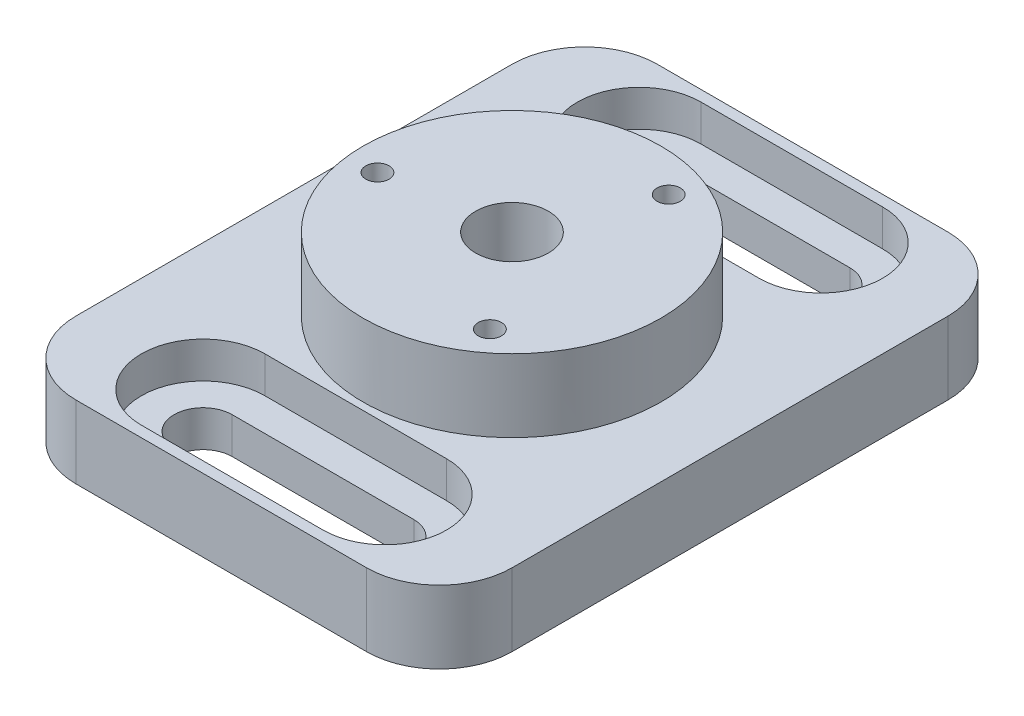
ISO-10303-21;
HEADER;
FILE_DESCRIPTION(('STEP AP214'),'2;1');
FILE_NAME('part.step','',(''),(''),'','','');
FILE_SCHEMA(('AUTOMOTIVE_DESIGN { 1 0 10303 214 1 1 1 1 }'));
ENDSEC;
DATA;
#1=APPLICATION_CONTEXT('core data for automotive mechanical design processes');
#2=APPLICATION_PROTOCOL_DEFINITION('international standard','automotive_design',2000,#1);
#3=PRODUCT_CONTEXT('',#1,'mechanical');
#4=PRODUCT('Part','Part','',(#3));
#5=PRODUCT_RELATED_PRODUCT_CATEGORY('part','',(#4));
#6=PRODUCT_DEFINITION_FORMATION('','',#4);
#7=PRODUCT_DEFINITION_CONTEXT('part definition',#1,'design');
#8=PRODUCT_DEFINITION('design','',#6,#7);
#9=PRODUCT_DEFINITION_SHAPE('','',#8);
#10=(LENGTH_UNIT() NAMED_UNIT(*) SI_UNIT(.MILLI.,.METRE.));
#11=(NAMED_UNIT(*) PLANE_ANGLE_UNIT() SI_UNIT($,.RADIAN.));
#12=(NAMED_UNIT(*) SI_UNIT($,.STERADIAN.) SOLID_ANGLE_UNIT());
#13=UNCERTAINTY_MEASURE_WITH_UNIT(LENGTH_MEASURE(1.E-05),#10,'distance_accuracy_value','');
#14=(GEOMETRIC_REPRESENTATION_CONTEXT(3) GLOBAL_UNCERTAINTY_ASSIGNED_CONTEXT((#13)) GLOBAL_UNIT_ASSIGNED_CONTEXT((#10,
#11,#12)) REPRESENTATION_CONTEXT('',''));
#15=CARTESIAN_POINT('',(0.,0.,0.));
#16=DIRECTION('',(0.,0.,1.));
#17=DIRECTION('',(1.,0.,0.));
#18=AXIS2_PLACEMENT_3D('',#15,#16,#17);
#19=CARTESIAN_POINT('',(6.31427663402399,20.,-15.2440122864362));
#20=DIRECTION('',(0.,-1.,0.));
#21=DIRECTION('',(0.,0.,-1.));
#22=AXIS2_PLACEMENT_3D('',#19,#20,#21);
#23=CYLINDRICAL_SURFACE('',#22,1.6);
#24=CARTESIAN_POINT('',(6.31427663402399,20.,-15.2440122864362));
#25=DIRECTION('',(0.,1.,0.));
#26=DIRECTION('',(0.,0.,1.));
#27=AXIS2_PLACEMENT_3D('',#24,#25,#26);
#28=CIRCLE('',#27,1.6);
#29=CARTESIAN_POINT('',(6.31427663402399,20.,-13.6440122864362));
#30=VERTEX_POINT('',#29);
#31=EDGE_CURVE('E459',#30,#30,#28,.T.);
#32=ORIENTED_EDGE('',*,*,#31,.T.);
#33=EDGE_LOOP('',(#32));
#34=FACE_BOUND('',#33,.T.);
#35=CARTESIAN_POINT('',(6.31427663402399,7.,-15.2440122864362));
#36=DIRECTION('',(0.,-1.,0.));
#37=DIRECTION('',(0.,0.,-1.));
#38=AXIS2_PLACEMENT_3D('',#35,#36,#37);
#39=CIRCLE('',#38,1.6);
#40=CARTESIAN_POINT('',(6.31427663402399,7.,-16.8440122864362));
#41=VERTEX_POINT('',#40);
#42=EDGE_CURVE('E49',#41,#41,#39,.T.);
#43=ORIENTED_EDGE('',*,*,#42,.T.);
#44=EDGE_LOOP('',(#43));
#45=FACE_BOUND('',#44,.T.);
#46=ADVANCED_FACE('F45',(#34,#45),#23,.F.);
#47=CARTESIAN_POINT('',(10.0445635786439,20.,13.0903301148054));
#48=DIRECTION('',(0.,-1.,0.));
#49=DIRECTION('',(0.,0.,-1.));
#50=AXIS2_PLACEMENT_3D('',#47,#48,#49);
#51=CYLINDRICAL_SURFACE('',#50,1.6);
#52=CARTESIAN_POINT('',(10.0445635786439,20.,13.0903301148054));
#53=DIRECTION('',(0.,1.,0.));
#54=DIRECTION('',(0.,0.,1.));
#55=AXIS2_PLACEMENT_3D('',#52,#53,#54);
#56=CIRCLE('',#55,1.6);
#57=CARTESIAN_POINT('',(10.0445635786439,20.,14.6903301148054));
#58=VERTEX_POINT('',#57);
#59=EDGE_CURVE('E455',#58,#58,#56,.T.);
#60=ORIENTED_EDGE('',*,*,#59,.T.);
#61=EDGE_LOOP('',(#60));
#62=FACE_BOUND('',#61,.T.);
#63=CARTESIAN_POINT('',(10.0445635786439,7.,13.0903301148054));
#64=DIRECTION('',(0.,-1.,0.));
#65=DIRECTION('',(0.,0.,-1.));
#66=AXIS2_PLACEMENT_3D('',#63,#64,#65);
#67=CIRCLE('',#66,1.6);
#68=CARTESIAN_POINT('',(10.0445635786439,7.,11.4903301148054));
#69=VERTEX_POINT('',#68);
#70=EDGE_CURVE('E517',#69,#69,#67,.T.);
#71=ORIENTED_EDGE('',*,*,#70,.T.);
#72=EDGE_LOOP('',(#71));
#73=FACE_BOUND('',#72,.T.);
#74=ADVANCED_FACE('F624',(#62,#73),#51,.F.);
#75=CARTESIAN_POINT('',(-16.3588402126679,20.,2.15368217163084));
#76=DIRECTION('',(0.,-1.,0.));
#77=DIRECTION('',(0.,0.,-1.));
#78=AXIS2_PLACEMENT_3D('',#75,#76,#77);
#79=CYLINDRICAL_SURFACE('',#78,1.6);
#80=CARTESIAN_POINT('',(-16.3588402126679,20.,2.15368217163084));
#81=DIRECTION('',(0.,1.,0.));
#82=DIRECTION('',(0.,0.,1.));
#83=AXIS2_PLACEMENT_3D('',#80,#81,#82);
#84=CIRCLE('',#83,1.6);
#85=CARTESIAN_POINT('',(-16.3588402126679,20.,3.75368217163085));
#86=VERTEX_POINT('',#85);
#87=EDGE_CURVE('E449',#86,#86,#84,.T.);
#88=ORIENTED_EDGE('',*,*,#87,.T.);
#89=EDGE_LOOP('',(#88));
#90=FACE_BOUND('',#89,.T.);
#91=CARTESIAN_POINT('',(-16.3588402126679,7.,2.15368217163084));
#92=DIRECTION('',(0.,-1.,0.));
#93=DIRECTION('',(0.,0.,-1.));
#94=AXIS2_PLACEMENT_3D('',#91,#92,#93);
#95=CIRCLE('',#94,1.6);
#96=CARTESIAN_POINT('',(-16.3588402126679,7.,0.553682171630843));
#97=VERTEX_POINT('',#96);
#98=EDGE_CURVE('E514',#97,#97,#95,.T.);
#99=ORIENTED_EDGE('',*,*,#98,.T.);
#100=EDGE_LOOP('',(#99));
#101=FACE_BOUND('',#100,.T.);
#102=ADVANCED_FACE('F630',(#90,#101),#79,.F.);
#103=CARTESIAN_POINT('',(-12.5,10.,-30.));
#104=DIRECTION('',(0.,-1.,0.));
#105=DIRECTION('',(0.,0.,-1.));
#106=AXIS2_PLACEMENT_3D('',#103,#104,#105);
#107=CYLINDRICAL_SURFACE('',#106,4.);
#108=CARTESIAN_POINT('',(-12.5,5.,-30.));
#109=DIRECTION('',(0.,1.,0.));
#110=DIRECTION('',(0.,0.,1.));
#111=AXIS2_PLACEMENT_3D('',#108,#109,#110);
#112=CIRCLE('',#111,4.);
#113=CARTESIAN_POINT('',(-12.5,5.,-26.));
#114=VERTEX_POINT('',#113);
#115=CARTESIAN_POINT('',(-12.5,5.,-34.));
#116=VERTEX_POINT('',#115);
#117=EDGE_CURVE('E341',#114,#116,#112,.F.);
#118=ORIENTED_EDGE('',*,*,#117,.F.);
#119=DIRECTION('',(0.,-1.,0.));
#120=VECTOR('',#119,1.);
#121=CARTESIAN_POINT('',(-12.5,10.,-26.));
#122=LINE('',#121,#120);
#123=CARTESIAN_POINT('',(-12.5,0.,-26.));
#124=VERTEX_POINT('',#123);
#125=EDGE_CURVE('E376',#114,#124,#122,.T.);
#126=ORIENTED_EDGE('',*,*,#125,.T.);
#127=CARTESIAN_POINT('',(-12.5,0.,-30.));
#128=DIRECTION('',(0.,-1.,0.));
#129=DIRECTION('',(0.,0.,1.));
#130=AXIS2_PLACEMENT_3D('',#127,#128,#129);
#131=CIRCLE('',#130,4.);
#132=CARTESIAN_POINT('',(-12.5,0.,-34.));
#133=VERTEX_POINT('',#132);
#134=EDGE_CURVE('E360',#124,#133,#131,.T.);
#135=ORIENTED_EDGE('',*,*,#134,.T.);
#136=DIRECTION('',(0.,-1.,0.));
#137=VECTOR('',#136,1.);
#138=CARTESIAN_POINT('',(-12.5,10.,-34.));
#139=LINE('',#138,#137);
#140=EDGE_CURVE('E375',#116,#133,#139,.T.);
#141=ORIENTED_EDGE('',*,*,#140,.F.);
#142=EDGE_LOOP('',(#118,#126,#135,#141));
#143=FACE_BOUND('',#142,.T.);
#144=ADVANCED_FACE('F677',(#143),#107,.F.);
#145=CARTESIAN_POINT('',(-12.5,10.,-26.));
#146=DIRECTION('',(0.,0.,1.));
#147=DIRECTION('',(1.,0.,0.));
#148=AXIS2_PLACEMENT_3D('',#145,#146,#147);
#149=PLANE('',#148);
#150=DIRECTION('',(-1.,0.,0.));
#151=VECTOR('',#150,1.);
#152=CARTESIAN_POINT('',(-12.5,5.,-26.));
#153=LINE('',#152,#151);
#154=CARTESIAN_POINT('',(12.5,5.,-26.));
#155=VERTEX_POINT('',#154);
#156=EDGE_CURVE('E338',#155,#114,#153,.T.);
#157=ORIENTED_EDGE('',*,*,#156,.F.);
#158=DIRECTION('',(0.,-1.,0.));
#159=VECTOR('',#158,1.);
#160=CARTESIAN_POINT('',(12.5,10.,-26.));
#161=LINE('',#160,#159);
#162=CARTESIAN_POINT('',(12.5,0.,-26.));
#163=VERTEX_POINT('',#162);
#164=EDGE_CURVE('E380',#155,#163,#161,.T.);
#165=ORIENTED_EDGE('',*,*,#164,.T.);
#166=DIRECTION('',(-1.,0.,0.));
#167=VECTOR('',#166,1.);
#168=CARTESIAN_POINT('',(-12.5,0.,-26.));
#169=LINE('',#168,#167);
#170=EDGE_CURVE('E371',#163,#124,#169,.T.);
#171=ORIENTED_EDGE('',*,*,#170,.T.);
#172=ORIENTED_EDGE('',*,*,#125,.F.);
#173=EDGE_LOOP('',(#157,#165,#171,#172));
#174=FACE_BOUND('',#173,.T.);
#175=ADVANCED_FACE('F682',(#174),#149,.F.);
#176=CARTESIAN_POINT('',(12.5,10.,-30.));
#177=DIRECTION('',(0.,-1.,0.));
#178=DIRECTION('',(0.,0.,-1.));
#179=AXIS2_PLACEMENT_3D('',#176,#177,#178);
#180=CYLINDRICAL_SURFACE('',#179,4.);
#181=CARTESIAN_POINT('',(12.5,5.,-30.));
#182=DIRECTION('',(0.,1.,0.));
#183=DIRECTION('',(0.,0.,1.));
#184=AXIS2_PLACEMENT_3D('',#181,#182,#183);
#185=CIRCLE('',#184,4.);
#186=CARTESIAN_POINT('',(12.5,5.,-34.));
#187=VERTEX_POINT('',#186);
#188=EDGE_CURVE('E290',#187,#155,#185,.F.);
#189=ORIENTED_EDGE('',*,*,#188,.F.);
#190=DIRECTION('',(0.,-1.,0.));
#191=VECTOR('',#190,1.);
#192=CARTESIAN_POINT('',(12.5,10.,-34.));
#193=LINE('',#192,#191);
#194=CARTESIAN_POINT('',(12.5,0.,-34.));
#195=VERTEX_POINT('',#194);
#196=EDGE_CURVE('E382',#187,#195,#193,.T.);
#197=ORIENTED_EDGE('',*,*,#196,.T.);
#198=CARTESIAN_POINT('',(12.5,0.,-30.));
#199=DIRECTION('',(0.,-1.,0.));
#200=DIRECTION('',(0.,0.,1.));
#201=AXIS2_PLACEMENT_3D('',#198,#199,#200);
#202=CIRCLE('',#201,4.);
#203=EDGE_CURVE('E368',#195,#163,#202,.T.);
#204=ORIENTED_EDGE('',*,*,#203,.T.);
#205=ORIENTED_EDGE('',*,*,#164,.F.);
#206=EDGE_LOOP('',(#189,#197,#204,#205));
#207=FACE_BOUND('',#206,.T.);
#208=ADVANCED_FACE('F737',(#207),#180,.F.);
#209=CARTESIAN_POINT('',(-12.5,10.,-34.));
#210=DIRECTION('',(0.,0.,-1.));
#211=DIRECTION('',(-1.,0.,0.));
#212=AXIS2_PLACEMENT_3D('',#209,#210,#211);
#213=PLANE('',#212);
#214=DIRECTION('',(1.,0.,0.));
#215=VECTOR('',#214,1.);
#216=CARTESIAN_POINT('',(-12.5,5.,-34.));
#217=LINE('',#216,#215);
#218=EDGE_CURVE('E466',#116,#187,#217,.T.);
#219=ORIENTED_EDGE('',*,*,#218,.F.);
#220=ORIENTED_EDGE('',*,*,#140,.T.);
#221=DIRECTION('',(1.,0.,0.));
#222=VECTOR('',#221,1.);
#223=CARTESIAN_POINT('',(-12.5,0.,-34.));
#224=LINE('',#223,#222);
#225=EDGE_CURVE('E364',#133,#195,#224,.T.);
#226=ORIENTED_EDGE('',*,*,#225,.T.);
#227=ORIENTED_EDGE('',*,*,#196,.F.);
#228=EDGE_LOOP('',(#219,#220,#226,#227));
#229=FACE_BOUND('',#228,.T.);
#230=ADVANCED_FACE('F636',(#229),#213,.F.);
#231=CARTESIAN_POINT('',(0.,20.,0.));
#232=DIRECTION('',(0.,1.,0.));
#233=DIRECTION('',(0.,0.,1.));
#234=AXIS2_PLACEMENT_3D('',#231,#232,#233);
#235=PLANE('',#234);
#236=ORIENTED_EDGE('',*,*,#87,.F.);
#237=EDGE_LOOP('',(#236));
#238=FACE_BOUND('',#237,.T.);
#239=ORIENTED_EDGE('',*,*,#31,.F.);
#240=EDGE_LOOP('',(#239));
#241=FACE_BOUND('',#240,.T.);
#242=CARTESIAN_POINT('',(0.,20.,0.));
#243=DIRECTION('',(0.,1.,0.));
#244=DIRECTION('',(0.,0.,1.));
#245=AXIS2_PLACEMENT_3D('',#242,#243,#244);
#246=CIRCLE('',#245,20.5);
#247=CARTESIAN_POINT('',(0.,20.,20.5));
#248=VERTEX_POINT('',#247);
#249=EDGE_CURVE('E462',#248,#248,#246,.T.);
#250=ORIENTED_EDGE('',*,*,#249,.T.);
#251=EDGE_LOOP('',(#250));
#252=FACE_BOUND('',#251,.T.);
#253=ORIENTED_EDGE('',*,*,#59,.F.);
#254=EDGE_LOOP('',(#253));
#255=FACE_BOUND('',#254,.T.);
#256=CARTESIAN_POINT('',(0.,20.,0.));
#257=DIRECTION('',(0.,1.,0.));
#258=DIRECTION('',(0.,0.,1.));
#259=AXIS2_PLACEMENT_3D('',#256,#257,#258);
#260=CIRCLE('',#259,5.);
#261=CARTESIAN_POINT('',(0.,20.,5.));
#262=VERTEX_POINT('',#261);
#263=EDGE_CURVE('E445',#262,#262,#260,.T.);
#264=ORIENTED_EDGE('',*,*,#263,.F.);
#265=EDGE_LOOP('',(#264));
#266=FACE_BOUND('',#265,.T.);
#267=ADVANCED_FACE('F565',(#238,#241,#252,#255,#266),#235,.T.);
#268=CARTESIAN_POINT('',(0.,0.,0.));
#269=DIRECTION('',(0.,1.,0.));
#270=DIRECTION('',(0.,0.,1.));
#271=AXIS2_PLACEMENT_3D('',#268,#269,#270);
#272=PLANE('',#271);
#273=CARTESIAN_POINT('',(10.0445635786439,0.,13.0903301148054));
#274=DIRECTION('',(0.,-1.,0.));
#275=DIRECTION('',(0.,0.,-1.));
#276=AXIS2_PLACEMENT_3D('',#273,#274,#275);
#277=CIRCLE('',#276,5.);
#278=CARTESIAN_POINT('',(10.0445635786439,0.,8.09033011480539));
#279=VERTEX_POINT('',#278);
#280=EDGE_CURVE('E541',#279,#279,#277,.T.);
#281=ORIENTED_EDGE('',*,*,#280,.F.);
#282=EDGE_LOOP('',(#281));
#283=FACE_BOUND('',#282,.T.);
#284=CARTESIAN_POINT('',(6.31427663402399,0.,-15.2440122864362));
#285=DIRECTION('',(0.,-1.,0.));
#286=DIRECTION('',(0.,0.,-1.));
#287=AXIS2_PLACEMENT_3D('',#284,#285,#286);
#288=CIRCLE('',#287,5.);
#289=CARTESIAN_POINT('',(6.31427663402399,0.,-20.2440122864362));
#290=VERTEX_POINT('',#289);
#291=EDGE_CURVE('E537',#290,#290,#288,.T.);
#292=ORIENTED_EDGE('',*,*,#291,.F.);
#293=EDGE_LOOP('',(#292));
#294=FACE_BOUND('',#293,.T.);
#295=CARTESIAN_POINT('',(-16.3588402126679,0.,2.15368217163084));
#296=DIRECTION('',(0.,-1.,0.));
#297=DIRECTION('',(0.,0.,-1.));
#298=AXIS2_PLACEMENT_3D('',#295,#296,#297);
#299=CIRCLE('',#298,5.);
#300=CARTESIAN_POINT('',(-16.3588402126679,0.,-2.84631782836916));
#301=VERTEX_POINT('',#300);
#302=EDGE_CURVE('E538',#301,#301,#299,.T.);
#303=ORIENTED_EDGE('',*,*,#302,.F.);
#304=EDGE_LOOP('',(#303));
#305=FACE_BOUND('',#304,.T.);
#306=CARTESIAN_POINT('',(0.,0.,0.));
#307=DIRECTION('',(0.,1.,0.));
#308=DIRECTION('',(0.,0.,1.));
#309=AXIS2_PLACEMENT_3D('',#306,#307,#308);
#310=CIRCLE('',#309,5.);
#311=CARTESIAN_POINT('',(0.,0.,5.));
#312=VERTEX_POINT('',#311);
#313=EDGE_CURVE('E430',#312,#312,#310,.T.);
#314=ORIENTED_EDGE('',*,*,#313,.T.);
#315=EDGE_LOOP('',(#314));
#316=FACE_BOUND('',#315,.T.);
#317=ORIENTED_EDGE('',*,*,#225,.F.);
#318=ORIENTED_EDGE('',*,*,#134,.F.);
#319=ORIENTED_EDGE('',*,*,#170,.F.);
#320=ORIENTED_EDGE('',*,*,#203,.F.);
#321=EDGE_LOOP('',(#317,#318,#319,#320));
#322=FACE_BOUND('',#321,.T.);
#323=DIRECTION('',(1.,0.,0.));
#324=VECTOR('',#323,1.);
#325=CARTESIAN_POINT('',(-12.5,0.,26.));
#326=LINE('',#325,#324);
#327=CARTESIAN_POINT('',(-12.5,0.,26.));
#328=VERTEX_POINT('',#327);
#329=CARTESIAN_POINT('',(12.5,0.,26.));
#330=VERTEX_POINT('',#329);
#331=EDGE_CURVE('E389',#328,#330,#326,.T.);
#332=ORIENTED_EDGE('',*,*,#331,.F.);
#333=CARTESIAN_POINT('',(-12.5,0.,30.));
#334=DIRECTION('',(0.,-1.,0.));
#335=DIRECTION('',(0.,0.,-1.));
#336=AXIS2_PLACEMENT_3D('',#333,#334,#335);
#337=CIRCLE('',#336,4.);
#338=CARTESIAN_POINT('',(-12.5,0.,34.));
#339=VERTEX_POINT('',#338);
#340=EDGE_CURVE('E379',#339,#328,#337,.T.);
#341=ORIENTED_EDGE('',*,*,#340,.F.);
#342=DIRECTION('',(-1.,0.,0.));
#343=VECTOR('',#342,1.);
#344=CARTESIAN_POINT('',(-12.5,0.,34.));
#345=LINE('',#344,#343);
#346=CARTESIAN_POINT('',(12.5,0.,34.));
#347=VERTEX_POINT('',#346);
#348=EDGE_CURVE('E397',#347,#339,#345,.T.);
#349=ORIENTED_EDGE('',*,*,#348,.F.);
#350=CARTESIAN_POINT('',(12.5,0.,30.));
#351=DIRECTION('',(0.,-1.,0.));
#352=DIRECTION('',(0.,0.,-1.));
#353=AXIS2_PLACEMENT_3D('',#350,#351,#352);
#354=CIRCLE('',#353,4.);
#355=EDGE_CURVE('E393',#330,#347,#354,.T.);
#356=ORIENTED_EDGE('',*,*,#355,.F.);
#357=EDGE_LOOP('',(#332,#341,#349,#356));
#358=FACE_BOUND('',#357,.T.);
#359=DIRECTION('',(1.,0.,0.));
#360=VECTOR('',#359,1.);
#361=CARTESIAN_POINT('',(-30.,0.,-40.));
#362=LINE('',#361,#360);
#363=CARTESIAN_POINT('',(-20.,0.,-40.));
#364=VERTEX_POINT('',#363);
#365=CARTESIAN_POINT('',(20.,0.,-40.));
#366=VERTEX_POINT('',#365);
#367=EDGE_CURVE('E419',#364,#366,#362,.T.);
#368=ORIENTED_EDGE('',*,*,#367,.T.);
#369=CARTESIAN_POINT('',(20.,0.,-30.));
#370=DIRECTION('',(0.,1.,0.));
#371=DIRECTION('',(0.,0.,1.));
#372=AXIS2_PLACEMENT_3D('',#369,#370,#371);
#373=CIRCLE('',#372,10.);
#374=CARTESIAN_POINT('',(30.,0.,-30.));
#375=VERTEX_POINT('',#374);
#376=EDGE_CURVE('E488',#366,#375,#373,.F.);
#377=ORIENTED_EDGE('',*,*,#376,.T.);
#378=DIRECTION('',(0.,0.,1.));
#379=VECTOR('',#378,1.);
#380=CARTESIAN_POINT('',(30.,0.,-40.));
#381=LINE('',#380,#379);
#382=CARTESIAN_POINT('',(30.,0.,30.));
#383=VERTEX_POINT('',#382);
#384=EDGE_CURVE('E405',#375,#383,#381,.T.);
#385=ORIENTED_EDGE('',*,*,#384,.T.);
#386=CARTESIAN_POINT('',(20.,0.,30.));
#387=DIRECTION('',(0.,1.,0.));
#388=DIRECTION('',(0.,0.,1.));
#389=AXIS2_PLACEMENT_3D('',#386,#387,#388);
#390=CIRCLE('',#389,10.);
#391=CARTESIAN_POINT('',(20.,0.,40.));
#392=VERTEX_POINT('',#391);
#393=EDGE_CURVE('E485',#383,#392,#390,.F.);
#394=ORIENTED_EDGE('',*,*,#393,.T.);
#395=DIRECTION('',(-1.,0.,0.));
#396=VECTOR('',#395,1.);
#397=CARTESIAN_POINT('',(-30.,0.,40.));
#398=LINE('',#397,#396);
#399=CARTESIAN_POINT('',(-20.,0.,40.));
#400=VERTEX_POINT('',#399);
#401=EDGE_CURVE('E434',#392,#400,#398,.T.);
#402=ORIENTED_EDGE('',*,*,#401,.T.);
#403=CARTESIAN_POINT('',(-20.,0.,30.));
#404=DIRECTION('',(0.,1.,0.));
#405=DIRECTION('',(0.,0.,1.));
#406=AXIS2_PLACEMENT_3D('',#403,#404,#405);
#407=CIRCLE('',#406,10.);
#408=CARTESIAN_POINT('',(-30.,0.,30.));
#409=VERTEX_POINT('',#408);
#410=EDGE_CURVE('E482',#400,#409,#407,.F.);
#411=ORIENTED_EDGE('',*,*,#410,.T.);
#412=DIRECTION('',(0.,0.,-1.));
#413=VECTOR('',#412,1.);
#414=CARTESIAN_POINT('',(-30.,0.,-40.));
#415=LINE('',#414,#413);
#416=CARTESIAN_POINT('',(-30.,0.,-30.));
#417=VERTEX_POINT('',#416);
#418=EDGE_CURVE('E438',#409,#417,#415,.T.);
#419=ORIENTED_EDGE('',*,*,#418,.T.);
#420=CARTESIAN_POINT('',(-20.,0.,-30.));
#421=DIRECTION('',(0.,1.,0.));
#422=DIRECTION('',(0.,0.,1.));
#423=AXIS2_PLACEMENT_3D('',#420,#421,#422);
#424=CIRCLE('',#423,10.);
#425=EDGE_CURVE('E479',#417,#364,#424,.F.);
#426=ORIENTED_EDGE('',*,*,#425,.T.);
#427=EDGE_LOOP('',(#368,#377,#385,#394,#402,#411,#419,#426));
#428=FACE_BOUND('',#427,.T.);
#429=ADVANCED_FACE('F561',(#283,#294,#305,#316,#322,#358,#428),#272,.F.);
#430=CARTESIAN_POINT('',(0.,20.,0.));
#431=DIRECTION('',(0.,-1.,0.));
#432=DIRECTION('',(0.,0.,-1.));
#433=AXIS2_PLACEMENT_3D('',#430,#431,#432);
#434=CYLINDRICAL_SURFACE('',#433,20.5);
#435=CARTESIAN_POINT('',(0.,10.,0.));
#436=DIRECTION('',(0.,-1.,0.));
#437=DIRECTION('',(0.,0.,-1.));
#438=AXIS2_PLACEMENT_3D('',#435,#436,#437);
#439=CIRCLE('',#438,20.5);
#440=CARTESIAN_POINT('',(0.,10.,-20.5));
#441=VERTEX_POINT('',#440);
#442=EDGE_CURVE('E356',#441,#441,#439,.T.);
#443=ORIENTED_EDGE('',*,*,#442,.F.);
#444=EDGE_LOOP('',(#443));
#445=FACE_BOUND('',#444,.T.);
#446=ORIENTED_EDGE('',*,*,#249,.F.);
#447=EDGE_LOOP('',(#446));
#448=FACE_BOUND('',#447,.T.);
#449=ADVANCED_FACE('F564',(#445,#448),#434,.T.);
#450=CARTESIAN_POINT('',(0.,20.,0.));
#451=DIRECTION('',(0.,-1.,0.));
#452=DIRECTION('',(0.,0.,-1.));
#453=AXIS2_PLACEMENT_3D('',#450,#451,#452);
#454=CYLINDRICAL_SURFACE('',#453,5.);
#455=ORIENTED_EDGE('',*,*,#263,.T.);
#456=EDGE_LOOP('',(#455));
#457=FACE_BOUND('',#456,.T.);
#458=ORIENTED_EDGE('',*,*,#313,.F.);
#459=EDGE_LOOP('',(#458));
#460=FACE_BOUND('',#459,.T.);
#461=ADVANCED_FACE('F639',(#457,#460),#454,.F.);
#462=CARTESIAN_POINT('',(30.,10.,-40.));
#463=DIRECTION('',(1.,0.,0.));
#464=DIRECTION('',(0.,0.,-1.));
#465=AXIS2_PLACEMENT_3D('',#462,#463,#464);
#466=PLANE('',#465);
#467=ORIENTED_EDGE('',*,*,#384,.F.);
#468=DIRECTION('',(0.,-1.,0.));
#469=VECTOR('',#468,1.);
#470=CARTESIAN_POINT('',(30.,10.,-30.));
#471=LINE('',#470,#469);
#472=CARTESIAN_POINT('',(30.,10.,-30.));
#473=VERTEX_POINT('',#472);
#474=EDGE_CURVE('E494',#375,#473,#471,.F.);
#475=ORIENTED_EDGE('',*,*,#474,.T.);
#476=DIRECTION('',(0.,0.,1.));
#477=VECTOR('',#476,1.);
#478=CARTESIAN_POINT('',(30.,10.,-40.));
#479=LINE('',#478,#477);
#480=CARTESIAN_POINT('',(30.,10.,30.));
#481=VERTEX_POINT('',#480);
#482=EDGE_CURVE('E414',#473,#481,#479,.T.);
#483=ORIENTED_EDGE('',*,*,#482,.T.);
#484=DIRECTION('',(0.,-1.,0.));
#485=VECTOR('',#484,1.);
#486=CARTESIAN_POINT('',(30.,10.,30.));
#487=LINE('',#486,#485);
#488=EDGE_CURVE('E490',#481,#383,#487,.T.);
#489=ORIENTED_EDGE('',*,*,#488,.T.);
#490=EDGE_LOOP('',(#467,#475,#483,#489));
#491=FACE_BOUND('',#490,.T.);
#492=ADVANCED_FACE('F606',(#491),#466,.T.);
#493=CARTESIAN_POINT('',(-30.,10.,-40.));
#494=DIRECTION('',(0.,0.,-1.));
#495=DIRECTION('',(-1.,0.,0.));
#496=AXIS2_PLACEMENT_3D('',#493,#494,#495);
#497=PLANE('',#496);
#498=DIRECTION('',(1.,0.,0.));
#499=VECTOR('',#498,1.);
#500=CARTESIAN_POINT('',(-30.,10.,-40.));
#501=LINE('',#500,#499);
#502=CARTESIAN_POINT('',(-20.,10.,-40.));
#503=VERTEX_POINT('',#502);
#504=CARTESIAN_POINT('',(20.,10.,-40.));
#505=VERTEX_POINT('',#504);
#506=EDGE_CURVE('E426',#503,#505,#501,.T.);
#507=ORIENTED_EDGE('',*,*,#506,.T.);
#508=DIRECTION('',(0.,-1.,0.));
#509=VECTOR('',#508,1.);
#510=CARTESIAN_POINT('',(20.,10.,-40.));
#511=LINE('',#510,#509);
#512=EDGE_CURVE('E476',#505,#366,#511,.T.);
#513=ORIENTED_EDGE('',*,*,#512,.T.);
#514=ORIENTED_EDGE('',*,*,#367,.F.);
#515=DIRECTION('',(0.,-1.,0.));
#516=VECTOR('',#515,1.);
#517=CARTESIAN_POINT('',(-20.,10.,-40.));
#518=LINE('',#517,#516);
#519=EDGE_CURVE('E473',#364,#503,#518,.F.);
#520=ORIENTED_EDGE('',*,*,#519,.T.);
#521=EDGE_LOOP('',(#507,#513,#514,#520));
#522=FACE_BOUND('',#521,.T.);
#523=ADVANCED_FACE('F585',(#522),#497,.T.);
#524=CARTESIAN_POINT('',(-30.,10.,-40.));
#525=DIRECTION('',(-1.,0.,0.));
#526=DIRECTION('',(0.,0.,1.));
#527=AXIS2_PLACEMENT_3D('',#524,#525,#526);
#528=PLANE('',#527);
#529=ORIENTED_EDGE('',*,*,#418,.F.);
#530=DIRECTION('',(0.,-1.,0.));
#531=VECTOR('',#530,1.);
#532=CARTESIAN_POINT('',(-30.,10.,30.));
#533=LINE('',#532,#531);
#534=CARTESIAN_POINT('',(-30.,10.,30.));
#535=VERTEX_POINT('',#534);
#536=EDGE_CURVE('E11',#409,#535,#533,.F.);
#537=ORIENTED_EDGE('',*,*,#536,.T.);
#538=DIRECTION('',(0.,0.,-1.));
#539=VECTOR('',#538,1.);
#540=CARTESIAN_POINT('',(-30.,10.,-40.));
#541=LINE('',#540,#539);
#542=CARTESIAN_POINT('',(-30.,10.,-30.));
#543=VERTEX_POINT('',#542);
#544=EDGE_CURVE('E422',#535,#543,#541,.T.);
#545=ORIENTED_EDGE('',*,*,#544,.T.);
#546=DIRECTION('',(0.,-1.,0.));
#547=VECTOR('',#546,1.);
#548=CARTESIAN_POINT('',(-30.,10.,-30.));
#549=LINE('',#548,#547);
#550=EDGE_CURVE('E55',#543,#417,#549,.T.);
#551=ORIENTED_EDGE('',*,*,#550,.T.);
#552=EDGE_LOOP('',(#529,#537,#545,#551));
#553=FACE_BOUND('',#552,.T.);
#554=ADVANCED_FACE('F595',(#553),#528,.T.);
#555=CARTESIAN_POINT('',(-30.,10.,40.));
#556=DIRECTION('',(0.,0.,1.));
#557=DIRECTION('',(1.,0.,0.));
#558=AXIS2_PLACEMENT_3D('',#555,#556,#557);
#559=PLANE('',#558);
#560=ORIENTED_EDGE('',*,*,#401,.F.);
#561=DIRECTION('',(0.,-1.,0.));
#562=VECTOR('',#561,1.);
#563=CARTESIAN_POINT('',(20.,10.,40.));
#564=LINE('',#563,#562);
#565=CARTESIAN_POINT('',(20.,10.,40.));
#566=VERTEX_POINT('',#565);
#567=EDGE_CURVE('E76',#392,#566,#564,.F.);
#568=ORIENTED_EDGE('',*,*,#567,.T.);
#569=DIRECTION('',(-1.,0.,0.));
#570=VECTOR('',#569,1.);
#571=CARTESIAN_POINT('',(-30.,10.,40.));
#572=LINE('',#571,#570);
#573=CARTESIAN_POINT('',(-20.,10.,40.));
#574=VERTEX_POINT('',#573);
#575=EDGE_CURVE('E418',#566,#574,#572,.T.);
#576=ORIENTED_EDGE('',*,*,#575,.T.);
#577=DIRECTION('',(0.,-1.,0.));
#578=VECTOR('',#577,1.);
#579=CARTESIAN_POINT('',(-20.,10.,40.));
#580=LINE('',#579,#578);
#581=EDGE_CURVE('E506',#574,#400,#580,.T.);
#582=ORIENTED_EDGE('',*,*,#581,.T.);
#583=EDGE_LOOP('',(#560,#568,#576,#582));
#584=FACE_BOUND('',#583,.T.);
#585=ADVANCED_FACE('F600',(#584),#559,.T.);
#586=CARTESIAN_POINT('',(0.,10.,0.));
#587=DIRECTION('',(0.,1.,0.));
#588=DIRECTION('',(0.,0.,1.));
#589=AXIS2_PLACEMENT_3D('',#586,#587,#588);
#590=PLANE('',#589);
#591=CARTESIAN_POINT('',(-12.5,10.,-30.));
#592=DIRECTION('',(0.,1.,0.));
#593=DIRECTION('',(0.,0.,1.));
#594=AXIS2_PLACEMENT_3D('',#591,#592,#593);
#595=CIRCLE('',#594,8.5);
#596=CARTESIAN_POINT('',(-12.5,10.,-38.5));
#597=VERTEX_POINT('',#596);
#598=CARTESIAN_POINT('',(-12.5,10.,-21.5));
#599=VERTEX_POINT('',#598);
#600=EDGE_CURVE('E247',#597,#599,#595,.T.);
#601=ORIENTED_EDGE('',*,*,#600,.F.);
#602=DIRECTION('',(-1.,0.,0.));
#603=VECTOR('',#602,1.);
#604=CARTESIAN_POINT('',(-12.5,10.,-38.5));
#605=LINE('',#604,#603);
#606=CARTESIAN_POINT('',(12.5,10.,-38.5));
#607=VERTEX_POINT('',#606);
#608=EDGE_CURVE('E266',#607,#597,#605,.T.);
#609=ORIENTED_EDGE('',*,*,#608,.F.);
#610=CARTESIAN_POINT('',(12.5,10.,-30.));
#611=DIRECTION('',(0.,1.,0.));
#612=DIRECTION('',(0.,0.,1.));
#613=AXIS2_PLACEMENT_3D('',#610,#611,#612);
#614=CIRCLE('',#613,8.5);
#615=CARTESIAN_POINT('',(12.5,10.,-21.5));
#616=VERTEX_POINT('',#615);
#617=EDGE_CURVE('E272',#616,#607,#614,.T.);
#618=ORIENTED_EDGE('',*,*,#617,.F.);
#619=DIRECTION('',(1.,0.,0.));
#620=VECTOR('',#619,1.);
#621=CARTESIAN_POINT('',(-12.5,10.,-21.5));
#622=LINE('',#621,#620);
#623=EDGE_CURVE('E283',#599,#616,#622,.T.);
#624=ORIENTED_EDGE('',*,*,#623,.F.);
#625=EDGE_LOOP('',(#601,#609,#618,#624));
#626=FACE_BOUND('',#625,.T.);
#627=CARTESIAN_POINT('',(-12.5,10.,30.));
#628=DIRECTION('',(0.,1.,0.));
#629=DIRECTION('',(0.,0.,-1.));
#630=AXIS2_PLACEMENT_3D('',#627,#628,#629);
#631=CIRCLE('',#630,8.5);
#632=CARTESIAN_POINT('',(-12.5,10.,21.5));
#633=VERTEX_POINT('',#632);
#634=CARTESIAN_POINT('',(-12.5,10.,38.5));
#635=VERTEX_POINT('',#634);
#636=EDGE_CURVE('E284',#633,#635,#631,.T.);
#637=ORIENTED_EDGE('',*,*,#636,.F.);
#638=DIRECTION('',(-1.,0.,0.));
#639=VECTOR('',#638,1.);
#640=CARTESIAN_POINT('',(-12.5,10.,21.5));
#641=LINE('',#640,#639);
#642=CARTESIAN_POINT('',(12.5,10.,21.5));
#643=VERTEX_POINT('',#642);
#644=EDGE_CURVE('E308',#643,#633,#641,.T.);
#645=ORIENTED_EDGE('',*,*,#644,.F.);
#646=CARTESIAN_POINT('',(12.5,10.,30.));
#647=DIRECTION('',(0.,1.,0.));
#648=DIRECTION('',(0.,0.,-1.));
#649=AXIS2_PLACEMENT_3D('',#646,#647,#648);
#650=CIRCLE('',#649,8.5);
#651=CARTESIAN_POINT('',(12.5,10.,38.5));
#652=VERTEX_POINT('',#651);
#653=EDGE_CURVE('E312',#652,#643,#650,.T.);
#654=ORIENTED_EDGE('',*,*,#653,.F.);
#655=DIRECTION('',(1.,0.,0.));
#656=VECTOR('',#655,1.);
#657=CARTESIAN_POINT('',(-12.5,10.,38.5));
#658=LINE('',#657,#656);
#659=EDGE_CURVE('E317',#635,#652,#658,.T.);
#660=ORIENTED_EDGE('',*,*,#659,.F.);
#661=EDGE_LOOP('',(#637,#645,#654,#660));
#662=FACE_BOUND('',#661,.T.);
#663=ORIENTED_EDGE('',*,*,#442,.T.);
#664=EDGE_LOOP('',(#663));
#665=FACE_BOUND('',#664,.T.);
#666=ORIENTED_EDGE('',*,*,#482,.F.);
#667=CARTESIAN_POINT('',(20.,10.,-30.));
#668=DIRECTION('',(0.,1.,0.));
#669=DIRECTION('',(0.,0.,1.));
#670=AXIS2_PLACEMENT_3D('',#667,#668,#669);
#671=CIRCLE('',#670,10.);
#672=EDGE_CURVE('E504',#473,#505,#671,.T.);
#673=ORIENTED_EDGE('',*,*,#672,.T.);
#674=ORIENTED_EDGE('',*,*,#506,.F.);
#675=CARTESIAN_POINT('',(-20.,10.,-30.));
#676=DIRECTION('',(0.,1.,0.));
#677=DIRECTION('',(0.,0.,1.));
#678=AXIS2_PLACEMENT_3D('',#675,#676,#677);
#679=CIRCLE('',#678,10.);
#680=EDGE_CURVE('E496',#503,#543,#679,.T.);
#681=ORIENTED_EDGE('',*,*,#680,.T.);
#682=ORIENTED_EDGE('',*,*,#544,.F.);
#683=CARTESIAN_POINT('',(-20.,10.,30.));
#684=DIRECTION('',(0.,1.,0.));
#685=DIRECTION('',(0.,0.,1.));
#686=AXIS2_PLACEMENT_3D('',#683,#684,#685);
#687=CIRCLE('',#686,10.);
#688=EDGE_CURVE('E66',#535,#574,#687,.T.);
#689=ORIENTED_EDGE('',*,*,#688,.T.);
#690=ORIENTED_EDGE('',*,*,#575,.F.);
#691=CARTESIAN_POINT('',(20.,10.,30.));
#692=DIRECTION('',(0.,1.,0.));
#693=DIRECTION('',(0.,0.,1.));
#694=AXIS2_PLACEMENT_3D('',#691,#692,#693);
#695=CIRCLE('',#694,10.);
#696=EDGE_CURVE('E501',#566,#481,#695,.T.);
#697=ORIENTED_EDGE('',*,*,#696,.T.);
#698=EDGE_LOOP('',(#666,#673,#674,#681,#682,#689,#690,#697));
#699=FACE_BOUND('',#698,.T.);
#700=ADVANCED_FACE('F592',(#626,#662,#665,#699),#590,.T.);
#701=CARTESIAN_POINT('',(-12.5,10.,30.));
#702=DIRECTION('',(0.,-1.,0.));
#703=DIRECTION('',(0.,0.,-1.));
#704=AXIS2_PLACEMENT_3D('',#701,#702,#703);
#705=CYLINDRICAL_SURFACE('',#704,4.);
#706=DIRECTION('',(0.,-1.,0.));
#707=VECTOR('',#706,1.);
#708=CARTESIAN_POINT('',(-12.5,10.,26.));
#709=LINE('',#708,#707);
#710=CARTESIAN_POINT('',(-12.5,5.,26.));
#711=VERTEX_POINT('',#710);
#712=EDGE_CURVE('E401',#711,#328,#709,.T.);
#713=ORIENTED_EDGE('',*,*,#712,.F.);
#714=CARTESIAN_POINT('',(-12.5,5.,30.));
#715=DIRECTION('',(0.,-1.,0.));
#716=DIRECTION('',(0.,0.,-1.));
#717=AXIS2_PLACEMENT_3D('',#714,#715,#716);
#718=CIRCLE('',#717,4.);
#719=CARTESIAN_POINT('',(-12.5,5.,34.));
#720=VERTEX_POINT('',#719);
#721=EDGE_CURVE('E352',#711,#720,#718,.F.);
#722=ORIENTED_EDGE('',*,*,#721,.T.);
#723=DIRECTION('',(0.,-1.,0.));
#724=VECTOR('',#723,1.);
#725=CARTESIAN_POINT('',(-12.5,10.,34.));
#726=LINE('',#725,#724);
#727=EDGE_CURVE('E402',#720,#339,#726,.T.);
#728=ORIENTED_EDGE('',*,*,#727,.T.);
#729=ORIENTED_EDGE('',*,*,#340,.T.);
#730=EDGE_LOOP('',(#713,#722,#728,#729));
#731=FACE_BOUND('',#730,.T.);
#732=ADVANCED_FACE('F657',(#731),#705,.F.);
#733=CARTESIAN_POINT('',(-12.5,10.,34.));
#734=DIRECTION('',(0.,0.,1.));
#735=DIRECTION('',(1.,0.,0.));
#736=AXIS2_PLACEMENT_3D('',#733,#734,#735);
#737=PLANE('',#736);
#738=ORIENTED_EDGE('',*,*,#727,.F.);
#739=DIRECTION('',(1.,0.,0.));
#740=VECTOR('',#739,1.);
#741=CARTESIAN_POINT('',(-12.5,5.,34.));
#742=LINE('',#741,#740);
#743=CARTESIAN_POINT('',(12.5,5.,34.));
#744=VERTEX_POINT('',#743);
#745=EDGE_CURVE('E348',#720,#744,#742,.T.);
#746=ORIENTED_EDGE('',*,*,#745,.T.);
#747=DIRECTION('',(0.,-1.,0.));
#748=VECTOR('',#747,1.);
#749=CARTESIAN_POINT('',(12.5,10.,34.));
#750=LINE('',#749,#748);
#751=EDGE_CURVE('E406',#744,#347,#750,.T.);
#752=ORIENTED_EDGE('',*,*,#751,.T.);
#753=ORIENTED_EDGE('',*,*,#348,.T.);
#754=EDGE_LOOP('',(#738,#746,#752,#753));
#755=FACE_BOUND('',#754,.T.);
#756=ADVANCED_FACE('F664',(#755),#737,.F.);
#757=CARTESIAN_POINT('',(12.5,10.,30.));
#758=DIRECTION('',(0.,-1.,0.));
#759=DIRECTION('',(0.,0.,-1.));
#760=AXIS2_PLACEMENT_3D('',#757,#758,#759);
#761=CYLINDRICAL_SURFACE('',#760,4.);
#762=ORIENTED_EDGE('',*,*,#751,.F.);
#763=CARTESIAN_POINT('',(12.5,5.,30.));
#764=DIRECTION('',(0.,-1.,0.));
#765=DIRECTION('',(0.,0.,-1.));
#766=AXIS2_PLACEMENT_3D('',#763,#764,#765);
#767=CIRCLE('',#766,4.);
#768=CARTESIAN_POINT('',(12.5,5.,26.));
#769=VERTEX_POINT('',#768);
#770=EDGE_CURVE('E344',#744,#769,#767,.F.);
#771=ORIENTED_EDGE('',*,*,#770,.T.);
#772=DIRECTION('',(0.,-1.,0.));
#773=VECTOR('',#772,1.);
#774=CARTESIAN_POINT('',(12.5,10.,26.));
#775=LINE('',#774,#773);
#776=EDGE_CURVE('E409',#769,#330,#775,.T.);
#777=ORIENTED_EDGE('',*,*,#776,.T.);
#778=ORIENTED_EDGE('',*,*,#355,.T.);
#779=EDGE_LOOP('',(#762,#771,#777,#778));
#780=FACE_BOUND('',#779,.T.);
#781=ADVANCED_FACE('F747',(#780),#761,.F.);
#782=CARTESIAN_POINT('',(-12.5,10.,26.));
#783=DIRECTION('',(0.,0.,-1.));
#784=DIRECTION('',(-1.,0.,0.));
#785=AXIS2_PLACEMENT_3D('',#782,#783,#784);
#786=PLANE('',#785);
#787=ORIENTED_EDGE('',*,*,#776,.F.);
#788=DIRECTION('',(-1.,0.,0.));
#789=VECTOR('',#788,1.);
#790=CARTESIAN_POINT('',(-12.5,5.,26.));
#791=LINE('',#790,#789);
#792=EDGE_CURVE('E469',#769,#711,#791,.T.);
#793=ORIENTED_EDGE('',*,*,#792,.T.);
#794=ORIENTED_EDGE('',*,*,#712,.T.);
#795=ORIENTED_EDGE('',*,*,#331,.T.);
#796=EDGE_LOOP('',(#787,#793,#794,#795));
#797=FACE_BOUND('',#796,.T.);
#798=ADVANCED_FACE('F707',(#797),#786,.F.);
#799=CARTESIAN_POINT('',(-12.5,5.,-30.));
#800=DIRECTION('',(0.,1.,0.));
#801=DIRECTION('',(0.,0.,1.));
#802=AXIS2_PLACEMENT_3D('',#799,#800,#801);
#803=PLANE('',#802);
#804=CARTESIAN_POINT('',(-12.5,5.,-30.));
#805=DIRECTION('',(0.,1.,0.));
#806=DIRECTION('',(0.,0.,1.));
#807=AXIS2_PLACEMENT_3D('',#804,#805,#806);
#808=CIRCLE('',#807,8.5);
#809=CARTESIAN_POINT('',(-12.5,5.,-38.5));
#810=VERTEX_POINT('',#809);
#811=CARTESIAN_POINT('',(-12.5,5.,-21.5));
#812=VERTEX_POINT('',#811);
#813=EDGE_CURVE('E244',#810,#812,#808,.T.);
#814=ORIENTED_EDGE('',*,*,#813,.T.);
#815=DIRECTION('',(1.,0.,0.));
#816=VECTOR('',#815,1.);
#817=CARTESIAN_POINT('',(-12.5,5.,-21.5));
#818=LINE('',#817,#816);
#819=CARTESIAN_POINT('',(12.5,5.,-21.5));
#820=VERTEX_POINT('',#819);
#821=EDGE_CURVE('E255',#812,#820,#818,.T.);
#822=ORIENTED_EDGE('',*,*,#821,.T.);
#823=CARTESIAN_POINT('',(12.5,5.,-30.));
#824=DIRECTION('',(0.,1.,0.));
#825=DIRECTION('',(0.,0.,1.));
#826=AXIS2_PLACEMENT_3D('',#823,#824,#825);
#827=CIRCLE('',#826,8.5);
#828=CARTESIAN_POINT('',(12.5,5.,-38.5));
#829=VERTEX_POINT('',#828);
#830=EDGE_CURVE('E260',#820,#829,#827,.T.);
#831=ORIENTED_EDGE('',*,*,#830,.T.);
#832=DIRECTION('',(-1.,0.,0.));
#833=VECTOR('',#832,1.);
#834=CARTESIAN_POINT('',(-12.5,5.,-38.5));
#835=LINE('',#834,#833);
#836=EDGE_CURVE('E252',#829,#810,#835,.T.);
#837=ORIENTED_EDGE('',*,*,#836,.T.);
#838=EDGE_LOOP('',(#814,#822,#831,#837));
#839=FACE_BOUND('',#838,.T.);
#840=ORIENTED_EDGE('',*,*,#117,.T.);
#841=ORIENTED_EDGE('',*,*,#218,.T.);
#842=ORIENTED_EDGE('',*,*,#188,.T.);
#843=ORIENTED_EDGE('',*,*,#156,.T.);
#844=EDGE_LOOP('',(#840,#841,#842,#843));
#845=FACE_BOUND('',#844,.T.);
#846=ADVANCED_FACE('F262',(#839,#845),#803,.T.);
#847=CARTESIAN_POINT('',(-12.5,5.,-30.));
#848=DIRECTION('',(0.,1.,0.));
#849=DIRECTION('',(0.,0.,1.));
#850=AXIS2_PLACEMENT_3D('',#847,#848,#849);
#851=CYLINDRICAL_SURFACE('',#850,8.5);
#852=ORIENTED_EDGE('',*,*,#600,.T.);
#853=DIRECTION('',(0.,1.,0.));
#854=VECTOR('',#853,1.);
#855=CARTESIAN_POINT('',(-12.5,5.,-21.5));
#856=LINE('',#855,#854);
#857=EDGE_CURVE('E240',#812,#599,#856,.T.);
#858=ORIENTED_EDGE('',*,*,#857,.F.);
#859=ORIENTED_EDGE('',*,*,#813,.F.);
#860=DIRECTION('',(0.,1.,0.));
#861=VECTOR('',#860,1.);
#862=CARTESIAN_POINT('',(-12.5,5.,-38.5));
#863=LINE('',#862,#861);
#864=EDGE_CURVE('E288',#810,#597,#863,.T.);
#865=ORIENTED_EDGE('',*,*,#864,.T.);
#866=EDGE_LOOP('',(#852,#858,#859,#865));
#867=FACE_BOUND('',#866,.T.);
#868=ADVANCED_FACE('F242',(#867),#851,.F.);
#869=CARTESIAN_POINT('',(-12.5,5.,-38.5));
#870=DIRECTION('',(0.,0.,-1.));
#871=DIRECTION('',(-1.,0.,0.));
#872=AXIS2_PLACEMENT_3D('',#869,#870,#871);
#873=PLANE('',#872);
#874=ORIENTED_EDGE('',*,*,#608,.T.);
#875=ORIENTED_EDGE('',*,*,#864,.F.);
#876=ORIENTED_EDGE('',*,*,#836,.F.);
#877=DIRECTION('',(0.,1.,0.));
#878=VECTOR('',#877,1.);
#879=CARTESIAN_POINT('',(12.5,5.,-38.5));
#880=LINE('',#879,#878);
#881=EDGE_CURVE('E291',#829,#607,#880,.T.);
#882=ORIENTED_EDGE('',*,*,#881,.T.);
#883=EDGE_LOOP('',(#874,#875,#876,#882));
#884=FACE_BOUND('',#883,.T.);
#885=ADVANCED_FACE('F708',(#884),#873,.F.);
#886=CARTESIAN_POINT('',(12.5,5.,-30.));
#887=DIRECTION('',(0.,1.,0.));
#888=DIRECTION('',(0.,0.,1.));
#889=AXIS2_PLACEMENT_3D('',#886,#887,#888);
#890=CYLINDRICAL_SURFACE('',#889,8.5);
#891=ORIENTED_EDGE('',*,*,#617,.T.);
#892=ORIENTED_EDGE('',*,*,#881,.F.);
#893=ORIENTED_EDGE('',*,*,#830,.F.);
#894=DIRECTION('',(0.,1.,0.));
#895=VECTOR('',#894,1.);
#896=CARTESIAN_POINT('',(12.5,5.,-21.5));
#897=LINE('',#896,#895);
#898=EDGE_CURVE('E251',#820,#616,#897,.T.);
#899=ORIENTED_EDGE('',*,*,#898,.T.);
#900=EDGE_LOOP('',(#891,#892,#893,#899));
#901=FACE_BOUND('',#900,.T.);
#902=ADVANCED_FACE('F711',(#901),#890,.F.);
#903=CARTESIAN_POINT('',(-12.5,5.,-21.5));
#904=DIRECTION('',(0.,0.,1.));
#905=DIRECTION('',(1.,0.,0.));
#906=AXIS2_PLACEMENT_3D('',#903,#904,#905);
#907=PLANE('',#906);
#908=ORIENTED_EDGE('',*,*,#623,.T.);
#909=ORIENTED_EDGE('',*,*,#898,.F.);
#910=ORIENTED_EDGE('',*,*,#821,.F.);
#911=ORIENTED_EDGE('',*,*,#857,.T.);
#912=EDGE_LOOP('',(#908,#909,#910,#911));
#913=FACE_BOUND('',#912,.T.);
#914=ADVANCED_FACE('F256',(#913),#907,.F.);
#915=CARTESIAN_POINT('',(-12.5,5.,30.));
#916=DIRECTION('',(0.,-1.,0.));
#917=DIRECTION('',(0.,0.,-1.));
#918=AXIS2_PLACEMENT_3D('',#915,#916,#917);
#919=PLANE('',#918);
#920=CARTESIAN_POINT('',(-12.5,5.,30.));
#921=DIRECTION('',(0.,1.,0.));
#922=DIRECTION('',(0.,0.,-1.));
#923=AXIS2_PLACEMENT_3D('',#920,#921,#922);
#924=CIRCLE('',#923,8.5);
#925=CARTESIAN_POINT('',(-12.5,5.,21.5));
#926=VERTEX_POINT('',#925);
#927=CARTESIAN_POINT('',(-12.5,5.,38.5));
#928=VERTEX_POINT('',#927);
#929=EDGE_CURVE('E313',#926,#928,#924,.T.);
#930=ORIENTED_EDGE('',*,*,#929,.T.);
#931=DIRECTION('',(1.,0.,0.));
#932=VECTOR('',#931,1.);
#933=CARTESIAN_POINT('',(-12.5,5.,38.5));
#934=LINE('',#933,#932);
#935=CARTESIAN_POINT('',(12.5,5.,38.5));
#936=VERTEX_POINT('',#935);
#937=EDGE_CURVE('E330',#928,#936,#934,.T.);
#938=ORIENTED_EDGE('',*,*,#937,.T.);
#939=CARTESIAN_POINT('',(12.5,5.,30.));
#940=DIRECTION('',(0.,1.,0.));
#941=DIRECTION('',(0.,0.,-1.));
#942=AXIS2_PLACEMENT_3D('',#939,#940,#941);
#943=CIRCLE('',#942,8.5);
#944=CARTESIAN_POINT('',(12.5,5.,21.5));
#945=VERTEX_POINT('',#944);
#946=EDGE_CURVE('E326',#936,#945,#943,.T.);
#947=ORIENTED_EDGE('',*,*,#946,.T.);
#948=DIRECTION('',(-1.,0.,0.));
#949=VECTOR('',#948,1.);
#950=CARTESIAN_POINT('',(-12.5,5.,21.5));
#951=LINE('',#950,#949);
#952=EDGE_CURVE('E298',#945,#926,#951,.T.);
#953=ORIENTED_EDGE('',*,*,#952,.T.);
#954=EDGE_LOOP('',(#930,#938,#947,#953));
#955=FACE_BOUND('',#954,.T.);
#956=ORIENTED_EDGE('',*,*,#792,.F.);
#957=ORIENTED_EDGE('',*,*,#770,.F.);
#958=ORIENTED_EDGE('',*,*,#745,.F.);
#959=ORIENTED_EDGE('',*,*,#721,.F.);
#960=EDGE_LOOP('',(#956,#957,#958,#959));
#961=FACE_BOUND('',#960,.T.);
#962=ADVANCED_FACE('F718',(#955,#961),#919,.F.);
#963=CARTESIAN_POINT('',(-12.5,5.,30.));
#964=DIRECTION('',(0.,1.,0.));
#965=DIRECTION('',(0.,0.,1.));
#966=AXIS2_PLACEMENT_3D('',#963,#964,#965);
#967=CYLINDRICAL_SURFACE('',#966,8.5);
#968=ORIENTED_EDGE('',*,*,#636,.T.);
#969=DIRECTION('',(0.,1.,0.));
#970=VECTOR('',#969,1.);
#971=CARTESIAN_POINT('',(-12.5,5.,38.5));
#972=LINE('',#971,#970);
#973=EDGE_CURVE('E294',#928,#635,#972,.T.);
#974=ORIENTED_EDGE('',*,*,#973,.F.);
#975=ORIENTED_EDGE('',*,*,#929,.F.);
#976=DIRECTION('',(0.,1.,0.));
#977=VECTOR('',#976,1.);
#978=CARTESIAN_POINT('',(-12.5,5.,21.5));
#979=LINE('',#978,#977);
#980=EDGE_CURVE('E305',#926,#633,#979,.T.);
#981=ORIENTED_EDGE('',*,*,#980,.T.);
#982=EDGE_LOOP('',(#968,#974,#975,#981));
#983=FACE_BOUND('',#982,.T.);
#984=ADVANCED_FACE('F721',(#983),#967,.F.);
#985=CARTESIAN_POINT('',(-12.5,5.,21.5));
#986=DIRECTION('',(0.,0.,-1.));
#987=DIRECTION('',(-1.,0.,0.));
#988=AXIS2_PLACEMENT_3D('',#985,#986,#987);
#989=PLANE('',#988);
#990=ORIENTED_EDGE('',*,*,#644,.T.);
#991=ORIENTED_EDGE('',*,*,#980,.F.);
#992=ORIENTED_EDGE('',*,*,#952,.F.);
#993=DIRECTION('',(0.,1.,0.));
#994=VECTOR('',#993,1.);
#995=CARTESIAN_POINT('',(12.5,5.,21.5));
#996=LINE('',#995,#994);
#997=EDGE_CURVE('E302',#945,#643,#996,.T.);
#998=ORIENTED_EDGE('',*,*,#997,.T.);
#999=EDGE_LOOP('',(#990,#991,#992,#998));
#1000=FACE_BOUND('',#999,.T.);
#1001=ADVANCED_FACE('F723',(#1000),#989,.F.);
#1002=CARTESIAN_POINT('',(12.5,5.,30.));
#1003=DIRECTION('',(0.,1.,0.));
#1004=DIRECTION('',(0.,0.,1.));
#1005=AXIS2_PLACEMENT_3D('',#1002,#1003,#1004);
#1006=CYLINDRICAL_SURFACE('',#1005,8.5);
#1007=ORIENTED_EDGE('',*,*,#653,.T.);
#1008=ORIENTED_EDGE('',*,*,#997,.F.);
#1009=ORIENTED_EDGE('',*,*,#946,.F.);
#1010=DIRECTION('',(0.,1.,0.));
#1011=VECTOR('',#1010,1.);
#1012=CARTESIAN_POINT('',(12.5,5.,38.5));
#1013=LINE('',#1012,#1011);
#1014=EDGE_CURVE('E299',#936,#652,#1013,.T.);
#1015=ORIENTED_EDGE('',*,*,#1014,.T.);
#1016=EDGE_LOOP('',(#1007,#1008,#1009,#1015));
#1017=FACE_BOUND('',#1016,.T.);
#1018=ADVANCED_FACE('F619',(#1017),#1006,.F.);
#1019=CARTESIAN_POINT('',(-12.5,5.,38.5));
#1020=DIRECTION('',(0.,0.,1.));
#1021=DIRECTION('',(1.,0.,0.));
#1022=AXIS2_PLACEMENT_3D('',#1019,#1020,#1021);
#1023=PLANE('',#1022);
#1024=ORIENTED_EDGE('',*,*,#659,.T.);
#1025=ORIENTED_EDGE('',*,*,#1014,.F.);
#1026=ORIENTED_EDGE('',*,*,#937,.F.);
#1027=ORIENTED_EDGE('',*,*,#973,.T.);
#1028=EDGE_LOOP('',(#1024,#1025,#1026,#1027));
#1029=FACE_BOUND('',#1028,.T.);
#1030=ADVANCED_FACE('F612',(#1029),#1023,.F.);
#1031=CARTESIAN_POINT('',(20.,10.,-30.));
#1032=DIRECTION('',(0.,-1.,0.));
#1033=DIRECTION('',(0.,0.,-1.));
#1034=AXIS2_PLACEMENT_3D('',#1031,#1032,#1033);
#1035=CYLINDRICAL_SURFACE('',#1034,10.);
#1036=ORIENTED_EDGE('',*,*,#672,.F.);
#1037=ORIENTED_EDGE('',*,*,#474,.F.);
#1038=ORIENTED_EDGE('',*,*,#376,.F.);
#1039=ORIENTED_EDGE('',*,*,#512,.F.);
#1040=EDGE_LOOP('',(#1036,#1037,#1038,#1039));
#1041=FACE_BOUND('',#1040,.T.);
#1042=ADVANCED_FACE('F610',(#1041),#1035,.T.);
#1043=CARTESIAN_POINT('',(20.,10.,30.));
#1044=DIRECTION('',(0.,-1.,0.));
#1045=DIRECTION('',(0.,0.,-1.));
#1046=AXIS2_PLACEMENT_3D('',#1043,#1044,#1045);
#1047=CYLINDRICAL_SURFACE('',#1046,10.);
#1048=ORIENTED_EDGE('',*,*,#696,.F.);
#1049=ORIENTED_EDGE('',*,*,#567,.F.);
#1050=ORIENTED_EDGE('',*,*,#393,.F.);
#1051=ORIENTED_EDGE('',*,*,#488,.F.);
#1052=EDGE_LOOP('',(#1048,#1049,#1050,#1051));
#1053=FACE_BOUND('',#1052,.T.);
#1054=ADVANCED_FACE('F604',(#1053),#1047,.T.);
#1055=CARTESIAN_POINT('',(-20.,10.,30.));
#1056=DIRECTION('',(0.,-1.,0.));
#1057=DIRECTION('',(0.,0.,-1.));
#1058=AXIS2_PLACEMENT_3D('',#1055,#1056,#1057);
#1059=CYLINDRICAL_SURFACE('',#1058,10.);
#1060=ORIENTED_EDGE('',*,*,#688,.F.);
#1061=ORIENTED_EDGE('',*,*,#536,.F.);
#1062=ORIENTED_EDGE('',*,*,#410,.F.);
#1063=ORIENTED_EDGE('',*,*,#581,.F.);
#1064=EDGE_LOOP('',(#1060,#1061,#1062,#1063));
#1065=FACE_BOUND('',#1064,.T.);
#1066=ADVANCED_FACE('F598',(#1065),#1059,.T.);
#1067=CARTESIAN_POINT('',(-20.,10.,-30.));
#1068=DIRECTION('',(0.,-1.,0.));
#1069=DIRECTION('',(0.,0.,-1.));
#1070=AXIS2_PLACEMENT_3D('',#1067,#1068,#1069);
#1071=CYLINDRICAL_SURFACE('',#1070,10.);
#1072=ORIENTED_EDGE('',*,*,#680,.F.);
#1073=ORIENTED_EDGE('',*,*,#519,.F.);
#1074=ORIENTED_EDGE('',*,*,#425,.F.);
#1075=ORIENTED_EDGE('',*,*,#550,.F.);
#1076=EDGE_LOOP('',(#1072,#1073,#1074,#1075));
#1077=FACE_BOUND('',#1076,.T.);
#1078=ADVANCED_FACE('F47',(#1077),#1071,.T.);
#1079=CARTESIAN_POINT('',(-16.3588402126679,7.,2.15368217163084));
#1080=DIRECTION('',(0.,-1.,0.));
#1081=DIRECTION('',(0.,0.,-1.));
#1082=AXIS2_PLACEMENT_3D('',#1079,#1080,#1081);
#1083=CYLINDRICAL_SURFACE('',#1082,5.);
#1084=CARTESIAN_POINT('',(-16.3588402126679,7.,2.15368217163084));
#1085=DIRECTION('',(0.,-1.,0.));
#1086=DIRECTION('',(0.,0.,-1.));
#1087=AXIS2_PLACEMENT_3D('',#1084,#1085,#1086);
#1088=CIRCLE('',#1087,5.);
#1089=CARTESIAN_POINT('',(-16.3588402126679,7.,-2.84631782836916));
#1090=VERTEX_POINT('',#1089);
#1091=EDGE_CURVE('E275',#1090,#1090,#1088,.T.);
#1092=ORIENTED_EDGE('',*,*,#1091,.F.);
#1093=EDGE_LOOP('',(#1092));
#1094=FACE_BOUND('',#1093,.T.);
#1095=ORIENTED_EDGE('',*,*,#302,.T.);
#1096=EDGE_LOOP('',(#1095));
#1097=FACE_BOUND('',#1096,.T.);
#1098=ADVANCED_FACE('F691',(#1094,#1097),#1083,.F.);
#1099=CARTESIAN_POINT('',(-16.3588402126679,7.,2.15368217163084));
#1100=DIRECTION('',(0.,-1.,0.));
#1101=DIRECTION('',(0.,0.,-1.));
#1102=AXIS2_PLACEMENT_3D('',#1099,#1100,#1101);
#1103=PLANE('',#1102);
#1104=ORIENTED_EDGE('',*,*,#98,.F.);
#1105=EDGE_LOOP('',(#1104));
#1106=FACE_BOUND('',#1105,.T.);
#1107=ORIENTED_EDGE('',*,*,#1091,.T.);
#1108=EDGE_LOOP('',(#1107));
#1109=FACE_BOUND('',#1108,.T.);
#1110=ADVANCED_FACE('F557',(#1106,#1109),#1103,.T.);
#1111=CARTESIAN_POINT('',(10.0445635786439,7.,13.0903301148054));
#1112=DIRECTION('',(0.,-1.,0.));
#1113=DIRECTION('',(0.,0.,-1.));
#1114=AXIS2_PLACEMENT_3D('',#1111,#1112,#1113);
#1115=CYLINDRICAL_SURFACE('',#1114,5.);
#1116=CARTESIAN_POINT('',(10.0445635786439,7.,13.0903301148054));
#1117=DIRECTION('',(0.,-1.,0.));
#1118=DIRECTION('',(0.,0.,-1.));
#1119=AXIS2_PLACEMENT_3D('',#1116,#1117,#1118);
#1120=CIRCLE('',#1119,5.);
#1121=CARTESIAN_POINT('',(10.0445635786439,7.,8.09033011480539));
#1122=VERTEX_POINT('',#1121);
#1123=EDGE_CURVE('E518',#1122,#1122,#1120,.T.);
#1124=ORIENTED_EDGE('',*,*,#1123,.F.);
#1125=EDGE_LOOP('',(#1124));
#1126=FACE_BOUND('',#1125,.T.);
#1127=ORIENTED_EDGE('',*,*,#280,.T.);
#1128=EDGE_LOOP('',(#1127));
#1129=FACE_BOUND('',#1128,.T.);
#1130=ADVANCED_FACE('F554',(#1126,#1129),#1115,.F.);
#1131=CARTESIAN_POINT('',(10.0445635786439,7.,13.0903301148054));
#1132=DIRECTION('',(0.,-1.,0.));
#1133=DIRECTION('',(0.,0.,-1.));
#1134=AXIS2_PLACEMENT_3D('',#1131,#1132,#1133);
#1135=PLANE('',#1134);
#1136=ORIENTED_EDGE('',*,*,#70,.F.);
#1137=EDGE_LOOP('',(#1136));
#1138=FACE_BOUND('',#1137,.T.);
#1139=ORIENTED_EDGE('',*,*,#1123,.T.);
#1140=EDGE_LOOP('',(#1139));
#1141=FACE_BOUND('',#1140,.T.);
#1142=ADVANCED_FACE('F552',(#1138,#1141),#1135,.T.);
#1143=CARTESIAN_POINT('',(6.31427663402399,7.,-15.2440122864362));
#1144=DIRECTION('',(0.,-1.,0.));
#1145=DIRECTION('',(0.,0.,-1.));
#1146=AXIS2_PLACEMENT_3D('',#1143,#1144,#1145);
#1147=CYLINDRICAL_SURFACE('',#1146,5.);
#1148=CARTESIAN_POINT('',(6.31427663402399,7.,-15.2440122864362));
#1149=DIRECTION('',(0.,-1.,0.));
#1150=DIRECTION('',(0.,0.,-1.));
#1151=AXIS2_PLACEMENT_3D('',#1148,#1149,#1150);
#1152=CIRCLE('',#1151,5.);
#1153=CARTESIAN_POINT('',(6.31427663402399,7.,-20.2440122864362));
#1154=VERTEX_POINT('',#1153);
#1155=EDGE_CURVE('E535',#1154,#1154,#1152,.T.);
#1156=ORIENTED_EDGE('',*,*,#1155,.F.);
#1157=EDGE_LOOP('',(#1156));
#1158=FACE_BOUND('',#1157,.T.);
#1159=ORIENTED_EDGE('',*,*,#291,.T.);
#1160=EDGE_LOOP('',(#1159));
#1161=FACE_BOUND('',#1160,.T.);
#1162=ADVANCED_FACE('F531',(#1158,#1161),#1147,.F.);
#1163=CARTESIAN_POINT('',(6.31427663402399,7.,-15.2440122864362));
#1164=DIRECTION('',(0.,-1.,0.));
#1165=DIRECTION('',(0.,0.,-1.));
#1166=AXIS2_PLACEMENT_3D('',#1163,#1164,#1165);
#1167=PLANE('',#1166);
#1168=ORIENTED_EDGE('',*,*,#42,.F.);
#1169=EDGE_LOOP('',(#1168));
#1170=FACE_BOUND('',#1169,.T.);
#1171=ORIENTED_EDGE('',*,*,#1155,.T.);
#1172=EDGE_LOOP('',(#1171));
#1173=FACE_BOUND('',#1172,.T.);
#1174=ADVANCED_FACE('F528',(#1170,#1173),#1167,.T.);
#1175=CLOSED_SHELL('',(#46,#74,#102,#144,#175,#208,#230,#267,#429,#449,#461,#492,#523,#554,#585,
#700,#732,#756,#781,#798,#846,#868,#885,#902,#914,#962,#984,#1001,#1018,#1030,#1042,#1054,#1066,
#1078,#1098,#1110,#1130,#1142,#1162,#1174));
#1176=MANIFOLD_SOLID_BREP('B2',#1175);
#1177=ADVANCED_BREP_SHAPE_REPRESENTATION('',(#18,#1176),#14);
#1178=SHAPE_DEFINITION_REPRESENTATION(#9,#1177);
ENDSEC;
END-ISO-10303-21;
